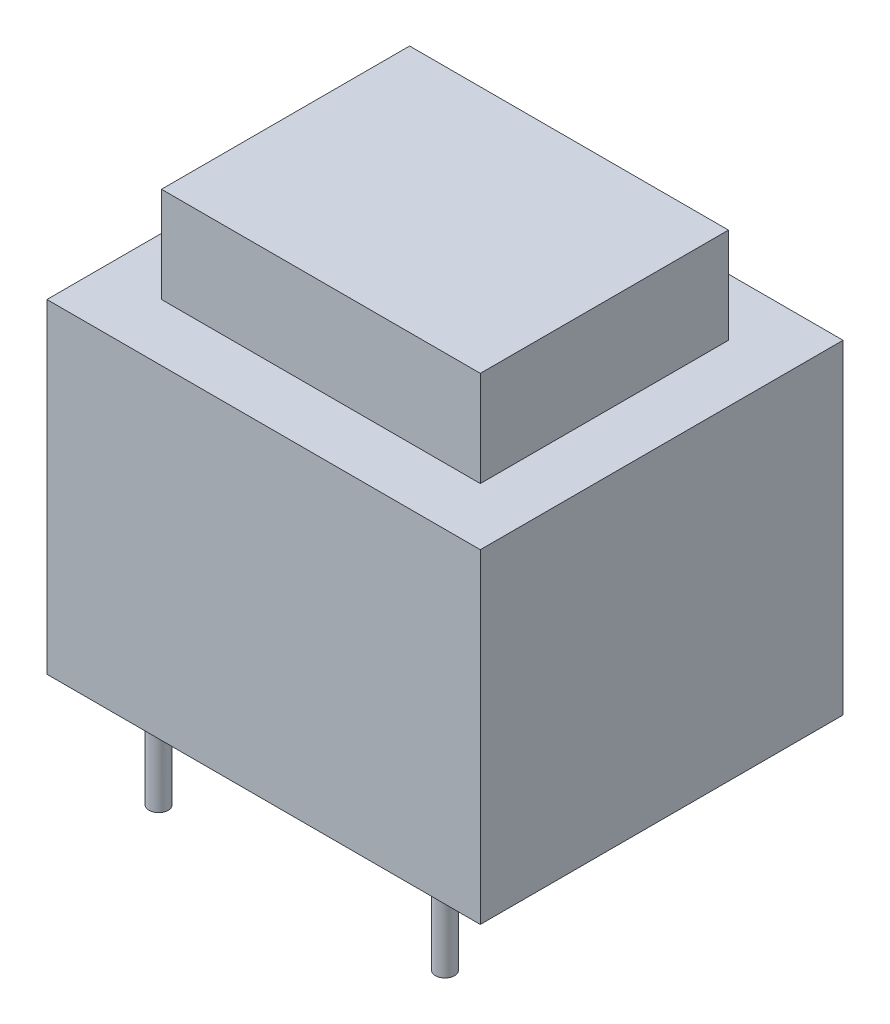
ISO-10303-21;
HEADER;
FILE_DESCRIPTION(('STEP AP214'),'2;1');
FILE_NAME('part.step','',(''),(''),'','','');
FILE_SCHEMA(('AUTOMOTIVE_DESIGN { 1 0 10303 214 1 1 1 1 }'));
ENDSEC;
DATA;
#1=APPLICATION_CONTEXT('core data for automotive mechanical design processes');
#2=APPLICATION_PROTOCOL_DEFINITION('international standard','automotive_design',2000,#1);
#3=PRODUCT_CONTEXT('',#1,'mechanical');
#4=PRODUCT('Part','Part','',(#3));
#5=PRODUCT_RELATED_PRODUCT_CATEGORY('part','',(#4));
#6=PRODUCT_DEFINITION_FORMATION('','',#4);
#7=PRODUCT_DEFINITION_CONTEXT('part definition',#1,'design');
#8=PRODUCT_DEFINITION('design','',#6,#7);
#9=PRODUCT_DEFINITION_SHAPE('','',#8);
#10=(LENGTH_UNIT() NAMED_UNIT(*) SI_UNIT(.MILLI.,.METRE.));
#11=(NAMED_UNIT(*) PLANE_ANGLE_UNIT() SI_UNIT($,.RADIAN.));
#12=(NAMED_UNIT(*) SI_UNIT($,.STERADIAN.) SOLID_ANGLE_UNIT());
#13=UNCERTAINTY_MEASURE_WITH_UNIT(LENGTH_MEASURE(1.E-05),#10,'distance_accuracy_value','');
#14=(GEOMETRIC_REPRESENTATION_CONTEXT(3) GLOBAL_UNCERTAINTY_ASSIGNED_CONTEXT((#13)) GLOBAL_UNIT_ASSIGNED_CONTEXT((#10,
#11,#12)) REPRESENTATION_CONTEXT('',''));
#15=CARTESIAN_POINT('',(0.,0.,0.));
#16=DIRECTION('',(0.,0.,1.));
#17=DIRECTION('',(1.,0.,0.));
#18=AXIS2_PLACEMENT_3D('',#15,#16,#17);
#19=CARTESIAN_POINT('',(0.,0.,19.));
#20=DIRECTION('',(1.,0.,0.));
#21=DIRECTION('',(0.,1.,0.));
#22=AXIS2_PLACEMENT_3D('',#19,#20,#21);
#23=PLANE('',#22);
#24=DIRECTION('',(0.,0.,1.));
#25=VECTOR('',#24,1.);
#26=CARTESIAN_POINT('',(0.,-5.,0.));
#27=LINE('',#26,#25);
#28=CARTESIAN_POINT('',(0.,-5.,0.));
#29=VERTEX_POINT('',#28);
#30=CARTESIAN_POINT('',(0.,-5.,19.));
#31=VERTEX_POINT('',#30);
#32=EDGE_CURVE('E136',#29,#31,#27,.T.);
#33=ORIENTED_EDGE('',*,*,#32,.F.);
#34=DIRECTION('',(0.,-1.,0.));
#35=VECTOR('',#34,1.);
#36=CARTESIAN_POINT('',(0.,0.,0.));
#37=LINE('',#36,#35);
#38=CARTESIAN_POINT('',(0.,-22.,0.));
#39=VERTEX_POINT('',#38);
#40=EDGE_CURVE('E158',#29,#39,#37,.T.);
#41=ORIENTED_EDGE('',*,*,#40,.T.);
#42=DIRECTION('',(0.,0.,-1.));
#43=VECTOR('',#42,1.);
#44=CARTESIAN_POINT('',(0.,-22.,19.));
#45=LINE('',#44,#43);
#46=CARTESIAN_POINT('',(0.,-22.,19.));
#47=VERTEX_POINT('',#46);
#48=EDGE_CURVE('E175',#47,#39,#45,.T.);
#49=ORIENTED_EDGE('',*,*,#48,.F.);
#50=DIRECTION('',(0.,-1.,0.));
#51=VECTOR('',#50,1.);
#52=CARTESIAN_POINT('',(0.,0.,19.));
#53=LINE('',#52,#51);
#54=EDGE_CURVE('E159',#31,#47,#53,.T.);
#55=ORIENTED_EDGE('',*,*,#54,.F.);
#56=EDGE_LOOP('',(#33,#41,#49,#55));
#57=FACE_BOUND('',#56,.T.);
#58=ADVANCED_FACE('F35',(#57),#23,.F.);
#59=CARTESIAN_POINT('',(22.7,0.,19.));
#60=DIRECTION('',(-1.,0.,0.));
#61=DIRECTION('',(0.,-1.,0.));
#62=AXIS2_PLACEMENT_3D('',#59,#60,#61);
#63=PLANE('',#62);
#64=DIRECTION('',(0.,0.,-1.));
#65=VECTOR('',#64,1.);
#66=CARTESIAN_POINT('',(22.7,-5.,0.));
#67=LINE('',#66,#65);
#68=CARTESIAN_POINT('',(22.7,-5.,19.));
#69=VERTEX_POINT('',#68);
#70=CARTESIAN_POINT('',(22.7,-5.,0.));
#71=VERTEX_POINT('',#70);
#72=EDGE_CURVE('E57',#69,#71,#67,.T.);
#73=ORIENTED_EDGE('',*,*,#72,.F.);
#74=DIRECTION('',(0.,1.,0.));
#75=VECTOR('',#74,1.);
#76=CARTESIAN_POINT('',(22.7,0.,19.));
#77=LINE('',#76,#75);
#78=CARTESIAN_POINT('',(22.7,-22.,19.));
#79=VERTEX_POINT('',#78);
#80=EDGE_CURVE('E164',#79,#69,#77,.T.);
#81=ORIENTED_EDGE('',*,*,#80,.F.);
#82=DIRECTION('',(0.,0.,-1.));
#83=VECTOR('',#82,1.);
#84=CARTESIAN_POINT('',(22.7,-22.,19.));
#85=LINE('',#84,#83);
#86=CARTESIAN_POINT('',(22.7,-22.,0.));
#87=VERTEX_POINT('',#86);
#88=EDGE_CURVE('E167',#79,#87,#85,.T.);
#89=ORIENTED_EDGE('',*,*,#88,.T.);
#90=DIRECTION('',(0.,1.,0.));
#91=VECTOR('',#90,1.);
#92=CARTESIAN_POINT('',(22.7,0.,0.));
#93=LINE('',#92,#91);
#94=EDGE_CURVE('E162',#87,#71,#93,.T.);
#95=ORIENTED_EDGE('',*,*,#94,.T.);
#96=EDGE_LOOP('',(#73,#81,#89,#95));
#97=FACE_BOUND('',#96,.T.);
#98=ADVANCED_FACE('F207',(#97),#63,.F.);
#99=CARTESIAN_POINT('',(0.,0.,19.));
#100=DIRECTION('',(0.,0.,1.));
#101=DIRECTION('',(1.,0.,0.));
#102=AXIS2_PLACEMENT_3D('',#99,#100,#101);
#103=PLANE('',#102);
#104=ORIENTED_EDGE('',*,*,#80,.T.);
#105=DIRECTION('',(1.,0.,0.));
#106=VECTOR('',#105,1.);
#107=CARTESIAN_POINT('',(0.,-5.,19.));
#108=LINE('',#107,#106);
#109=EDGE_CURVE('E141',#31,#69,#108,.T.);
#110=ORIENTED_EDGE('',*,*,#109,.F.);
#111=ORIENTED_EDGE('',*,*,#54,.T.);
#112=DIRECTION('',(1.,0.,0.));
#113=VECTOR('',#112,1.);
#114=CARTESIAN_POINT('',(0.,-22.,19.));
#115=LINE('',#114,#113);
#116=EDGE_CURVE('E161',#47,#79,#115,.T.);
#117=ORIENTED_EDGE('',*,*,#116,.T.);
#118=EDGE_LOOP('',(#104,#110,#111,#117));
#119=FACE_BOUND('',#118,.T.);
#120=ADVANCED_FACE('F213',(#119),#103,.T.);
#121=CARTESIAN_POINT('',(0.,0.,0.));
#122=DIRECTION('',(0.,0.,1.));
#123=DIRECTION('',(1.,0.,0.));
#124=AXIS2_PLACEMENT_3D('',#121,#122,#123);
#125=PLANE('',#124);
#126=DIRECTION('',(-1.,0.,0.));
#127=VECTOR('',#126,1.);
#128=CARTESIAN_POINT('',(0.,-5.,0.));
#129=LINE('',#128,#127);
#130=EDGE_CURVE('E144',#71,#29,#129,.T.);
#131=ORIENTED_EDGE('',*,*,#130,.F.);
#132=ORIENTED_EDGE('',*,*,#94,.F.);
#133=DIRECTION('',(1.,0.,0.));
#134=VECTOR('',#133,1.);
#135=CARTESIAN_POINT('',(0.,-22.,0.));
#136=LINE('',#135,#134);
#137=EDGE_CURVE('E169',#39,#87,#136,.T.);
#138=ORIENTED_EDGE('',*,*,#137,.F.);
#139=ORIENTED_EDGE('',*,*,#40,.F.);
#140=EDGE_LOOP('',(#131,#132,#138,#139));
#141=FACE_BOUND('',#140,.T.);
#142=ADVANCED_FACE('F192',(#141),#125,.F.);
#143=CARTESIAN_POINT('',(0.,-22.,19.));
#144=DIRECTION('',(0.,1.,0.));
#145=DIRECTION('',(0.,0.,1.));
#146=AXIS2_PLACEMENT_3D('',#143,#144,#145);
#147=PLANE('',#146);
#148=CARTESIAN_POINT('',(13.85,-22.,2.));
#149=DIRECTION('',(0.,1.,0.));
#150=DIRECTION('',(0.,0.,1.));
#151=AXIS2_PLACEMENT_3D('',#148,#149,#150);
#152=CIRCLE('',#151,0.500000000000001);
#153=CARTESIAN_POINT('',(13.85,-22.,2.5));
#154=VERTEX_POINT('',#153);
#155=EDGE_CURVE('E11',#154,#154,#152,.F.);
#156=ORIENTED_EDGE('',*,*,#155,.F.);
#157=EDGE_LOOP('',(#156));
#158=FACE_BOUND('',#157,.T.);
#159=CARTESIAN_POINT('',(8.85,-22.,2.));
#160=DIRECTION('',(0.,1.,0.));
#161=DIRECTION('',(0.,0.,1.));
#162=AXIS2_PLACEMENT_3D('',#159,#160,#161);
#163=CIRCLE('',#162,0.500000000000001);
#164=CARTESIAN_POINT('',(8.85,-22.,2.5));
#165=VERTEX_POINT('',#164);
#166=EDGE_CURVE('E42',#165,#165,#163,.F.);
#167=ORIENTED_EDGE('',*,*,#166,.F.);
#168=EDGE_LOOP('',(#167));
#169=FACE_BOUND('',#168,.T.);
#170=CARTESIAN_POINT('',(3.85,-22.,17.));
#171=DIRECTION('',(0.,1.,0.));
#172=DIRECTION('',(0.,0.,1.));
#173=AXIS2_PLACEMENT_3D('',#170,#171,#172);
#174=CIRCLE('',#173,0.500000000000001);
#175=CARTESIAN_POINT('',(3.85,-22.,17.5));
#176=VERTEX_POINT('',#175);
#177=EDGE_CURVE('E181',#176,#176,#174,.F.);
#178=ORIENTED_EDGE('',*,*,#177,.F.);
#179=EDGE_LOOP('',(#178));
#180=FACE_BOUND('',#179,.T.);
#181=CARTESIAN_POINT('',(18.85,-22.,17.));
#182=DIRECTION('',(0.,1.,0.));
#183=DIRECTION('',(0.,0.,1.));
#184=AXIS2_PLACEMENT_3D('',#181,#182,#183);
#185=CIRCLE('',#184,0.499999999999999);
#186=CARTESIAN_POINT('',(18.85,-22.,17.5));
#187=VERTEX_POINT('',#186);
#188=EDGE_CURVE('E178',#187,#187,#185,.F.);
#189=ORIENTED_EDGE('',*,*,#188,.F.);
#190=EDGE_LOOP('',(#189));
#191=FACE_BOUND('',#190,.T.);
#192=ORIENTED_EDGE('',*,*,#137,.T.);
#193=ORIENTED_EDGE('',*,*,#88,.F.);
#194=ORIENTED_EDGE('',*,*,#116,.F.);
#195=ORIENTED_EDGE('',*,*,#48,.T.);
#196=EDGE_LOOP('',(#192,#193,#194,#195));
#197=FACE_BOUND('',#196,.T.);
#198=ADVANCED_FACE('F188',(#158,#169,#180,#191,#197),#147,.F.);
#199=CARTESIAN_POINT('',(18.85,-27.,17.));
#200=DIRECTION('',(0.,1.,0.));
#201=DIRECTION('',(0.,0.,1.));
#202=AXIS2_PLACEMENT_3D('',#199,#200,#201);
#203=CYLINDRICAL_SURFACE('',#202,0.499999999999999);
#204=CARTESIAN_POINT('',(18.85,-27.,17.));
#205=DIRECTION('',(0.,-1.,0.));
#206=DIRECTION('',(0.,0.,-1.));
#207=AXIS2_PLACEMENT_3D('',#204,#205,#206);
#208=CIRCLE('',#207,0.499999999999999);
#209=CARTESIAN_POINT('',(18.85,-27.,16.5));
#210=VERTEX_POINT('',#209);
#211=EDGE_CURVE('E155',#210,#210,#208,.T.);
#212=ORIENTED_EDGE('',*,*,#211,.F.);
#213=EDGE_LOOP('',(#212));
#214=FACE_BOUND('',#213,.T.);
#215=ORIENTED_EDGE('',*,*,#188,.T.);
#216=EDGE_LOOP('',(#215));
#217=FACE_BOUND('',#216,.T.);
#218=ADVANCED_FACE('F191',(#214,#217),#203,.T.);
#219=CARTESIAN_POINT('',(18.85,-27.,17.));
#220=DIRECTION('',(0.,-1.,0.));
#221=DIRECTION('',(0.,0.,-1.));
#222=AXIS2_PLACEMENT_3D('',#219,#220,#221);
#223=PLANE('',#222);
#224=ORIENTED_EDGE('',*,*,#211,.T.);
#225=EDGE_LOOP('',(#224));
#226=FACE_BOUND('',#225,.T.);
#227=ADVANCED_FACE('F323',(#226),#223,.T.);
#228=CARTESIAN_POINT('',(3.85,-27.,17.));
#229=DIRECTION('',(0.,1.,0.));
#230=DIRECTION('',(0.,0.,1.));
#231=AXIS2_PLACEMENT_3D('',#228,#229,#230);
#232=CYLINDRICAL_SURFACE('',#231,0.500000000000001);
#233=CARTESIAN_POINT('',(3.85,-27.,17.));
#234=DIRECTION('',(0.,-1.,0.));
#235=DIRECTION('',(0.,0.,-1.));
#236=AXIS2_PLACEMENT_3D('',#233,#234,#235);
#237=CIRCLE('',#236,0.500000000000001);
#238=CARTESIAN_POINT('',(3.85,-27.,16.5));
#239=VERTEX_POINT('',#238);
#240=EDGE_CURVE('E152',#239,#239,#237,.T.);
#241=ORIENTED_EDGE('',*,*,#240,.F.);
#242=EDGE_LOOP('',(#241));
#243=FACE_BOUND('',#242,.T.);
#244=ORIENTED_EDGE('',*,*,#177,.T.);
#245=EDGE_LOOP('',(#244));
#246=FACE_BOUND('',#245,.T.);
#247=ADVANCED_FACE('F319',(#243,#246),#232,.T.);
#248=CARTESIAN_POINT('',(3.85,-27.,17.));
#249=DIRECTION('',(0.,-1.,0.));
#250=DIRECTION('',(0.,0.,-1.));
#251=AXIS2_PLACEMENT_3D('',#248,#249,#250);
#252=PLANE('',#251);
#253=ORIENTED_EDGE('',*,*,#240,.T.);
#254=EDGE_LOOP('',(#253));
#255=FACE_BOUND('',#254,.T.);
#256=ADVANCED_FACE('F315',(#255),#252,.T.);
#257=CARTESIAN_POINT('',(8.85,-27.,2.));
#258=DIRECTION('',(0.,1.,0.));
#259=DIRECTION('',(0.,0.,1.));
#260=AXIS2_PLACEMENT_3D('',#257,#258,#259);
#261=CYLINDRICAL_SURFACE('',#260,0.500000000000001);
#262=CARTESIAN_POINT('',(8.85,-27.,2.));
#263=DIRECTION('',(0.,-1.,0.));
#264=DIRECTION('',(0.,0.,-1.));
#265=AXIS2_PLACEMENT_3D('',#262,#263,#264);
#266=CIRCLE('',#265,0.500000000000001);
#267=CARTESIAN_POINT('',(8.85,-27.,1.5));
#268=VERTEX_POINT('',#267);
#269=EDGE_CURVE('E149',#268,#268,#266,.T.);
#270=ORIENTED_EDGE('',*,*,#269,.F.);
#271=EDGE_LOOP('',(#270));
#272=FACE_BOUND('',#271,.T.);
#273=ORIENTED_EDGE('',*,*,#166,.T.);
#274=EDGE_LOOP('',(#273));
#275=FACE_BOUND('',#274,.T.);
#276=ADVANCED_FACE('F186',(#272,#275),#261,.T.);
#277=CARTESIAN_POINT('',(8.85,-27.,2.));
#278=DIRECTION('',(0.,-1.,0.));
#279=DIRECTION('',(0.,0.,-1.));
#280=AXIS2_PLACEMENT_3D('',#277,#278,#279);
#281=PLANE('',#280);
#282=ORIENTED_EDGE('',*,*,#269,.T.);
#283=EDGE_LOOP('',(#282));
#284=FACE_BOUND('',#283,.T.);
#285=ADVANCED_FACE('F308',(#284),#281,.T.);
#286=CARTESIAN_POINT('',(13.85,-27.,2.));
#287=DIRECTION('',(0.,1.,0.));
#288=DIRECTION('',(0.,0.,1.));
#289=AXIS2_PLACEMENT_3D('',#286,#287,#288);
#290=CYLINDRICAL_SURFACE('',#289,0.500000000000001);
#291=CARTESIAN_POINT('',(13.85,-27.,2.));
#292=DIRECTION('',(0.,-1.,0.));
#293=DIRECTION('',(0.,0.,-1.));
#294=AXIS2_PLACEMENT_3D('',#291,#292,#293);
#295=CIRCLE('',#294,0.500000000000001);
#296=CARTESIAN_POINT('',(13.85,-27.,1.5));
#297=VERTEX_POINT('',#296);
#298=EDGE_CURVE('E146',#297,#297,#295,.T.);
#299=ORIENTED_EDGE('',*,*,#298,.F.);
#300=EDGE_LOOP('',(#299));
#301=FACE_BOUND('',#300,.T.);
#302=ORIENTED_EDGE('',*,*,#155,.T.);
#303=EDGE_LOOP('',(#302));
#304=FACE_BOUND('',#303,.T.);
#305=ADVANCED_FACE('F304',(#301,#304),#290,.T.);
#306=CARTESIAN_POINT('',(13.85,-27.,2.));
#307=DIRECTION('',(0.,-1.,0.));
#308=DIRECTION('',(0.,0.,-1.));
#309=AXIS2_PLACEMENT_3D('',#306,#307,#308);
#310=PLANE('',#309);
#311=ORIENTED_EDGE('',*,*,#298,.T.);
#312=EDGE_LOOP('',(#311));
#313=FACE_BOUND('',#312,.T.);
#314=ADVANCED_FACE('F252',(#313),#310,.T.);
#315=CARTESIAN_POINT('',(0.,-5.,0.));
#316=DIRECTION('',(0.,1.,0.));
#317=DIRECTION('',(0.,0.,1.));
#318=AXIS2_PLACEMENT_3D('',#315,#316,#317);
#319=PLANE('',#318);
#320=DIRECTION('',(-1.,0.,0.));
#321=VECTOR('',#320,1.);
#322=CARTESIAN_POINT('',(3.,-5.,3.00359604437299));
#323=LINE('',#322,#321);
#324=CARTESIAN_POINT('',(19.7,-5.,3.00359604437299));
#325=VERTEX_POINT('',#324);
#326=CARTESIAN_POINT('',(3.,-5.,3.00359604437299));
#327=VERTEX_POINT('',#326);
#328=EDGE_CURVE('E111',#325,#327,#323,.T.);
#329=ORIENTED_EDGE('',*,*,#328,.F.);
#330=DIRECTION('',(0.,0.,-1.));
#331=VECTOR('',#330,1.);
#332=CARTESIAN_POINT('',(19.7,-5.,3.00359604437299));
#333=LINE('',#332,#331);
#334=CARTESIAN_POINT('',(19.7,-5.,16.));
#335=VERTEX_POINT('',#334);
#336=EDGE_CURVE('E120',#335,#325,#333,.T.);
#337=ORIENTED_EDGE('',*,*,#336,.F.);
#338=DIRECTION('',(1.,0.,0.));
#339=VECTOR('',#338,1.);
#340=CARTESIAN_POINT('',(3.,-5.,16.));
#341=LINE('',#340,#339);
#342=CARTESIAN_POINT('',(3.,-5.,16.));
#343=VERTEX_POINT('',#342);
#344=EDGE_CURVE('E103',#343,#335,#341,.T.);
#345=ORIENTED_EDGE('',*,*,#344,.F.);
#346=DIRECTION('',(0.,0.,1.));
#347=VECTOR('',#346,1.);
#348=CARTESIAN_POINT('',(3.,-5.,3.00359604437299));
#349=LINE('',#348,#347);
#350=EDGE_CURVE('E117',#327,#343,#349,.T.);
#351=ORIENTED_EDGE('',*,*,#350,.F.);
#352=EDGE_LOOP('',(#329,#337,#345,#351));
#353=FACE_BOUND('',#352,.T.);
#354=ORIENTED_EDGE('',*,*,#32,.T.);
#355=ORIENTED_EDGE('',*,*,#109,.T.);
#356=ORIENTED_EDGE('',*,*,#72,.T.);
#357=ORIENTED_EDGE('',*,*,#130,.T.);
#358=EDGE_LOOP('',(#354,#355,#356,#357));
#359=FACE_BOUND('',#358,.T.);
#360=ADVANCED_FACE('F116',(#353,#359),#319,.T.);
#361=CARTESIAN_POINT('',(3.,-5.,3.00359604437299));
#362=DIRECTION('',(-1.,0.,0.));
#363=DIRECTION('',(0.,0.,1.));
#364=AXIS2_PLACEMENT_3D('',#361,#362,#363);
#365=PLANE('',#364);
#366=DIRECTION('',(0.,0.,1.));
#367=VECTOR('',#366,1.);
#368=CARTESIAN_POINT('',(3.,0.,3.00359604437299));
#369=LINE('',#368,#367);
#370=CARTESIAN_POINT('',(3.,0.,3.00359604437299));
#371=VERTEX_POINT('',#370);
#372=CARTESIAN_POINT('',(3.,0.,16.));
#373=VERTEX_POINT('',#372);
#374=EDGE_CURVE('E131',#371,#373,#369,.T.);
#375=ORIENTED_EDGE('',*,*,#374,.F.);
#376=DIRECTION('',(0.,1.,0.));
#377=VECTOR('',#376,1.);
#378=CARTESIAN_POINT('',(3.,-5.,3.00359604437299));
#379=LINE('',#378,#377);
#380=EDGE_CURVE('E123',#327,#371,#379,.T.);
#381=ORIENTED_EDGE('',*,*,#380,.F.);
#382=ORIENTED_EDGE('',*,*,#350,.T.);
#383=DIRECTION('',(0.,1.,0.));
#384=VECTOR('',#383,1.);
#385=CARTESIAN_POINT('',(3.,-5.,16.));
#386=LINE('',#385,#384);
#387=EDGE_CURVE('E100',#343,#373,#386,.T.);
#388=ORIENTED_EDGE('',*,*,#387,.T.);
#389=EDGE_LOOP('',(#375,#381,#382,#388));
#390=FACE_BOUND('',#389,.T.);
#391=ADVANCED_FACE('F122',(#390),#365,.T.);
#392=CARTESIAN_POINT('',(3.,-5.,3.00359604437299));
#393=DIRECTION('',(0.,0.,-1.));
#394=DIRECTION('',(-1.,0.,0.));
#395=AXIS2_PLACEMENT_3D('',#392,#393,#394);
#396=PLANE('',#395);
#397=DIRECTION('',(-1.,0.,0.));
#398=VECTOR('',#397,1.);
#399=CARTESIAN_POINT('',(3.,0.,3.00359604437299));
#400=LINE('',#399,#398);
#401=CARTESIAN_POINT('',(19.7,0.,3.00359604437299));
#402=VERTEX_POINT('',#401);
#403=EDGE_CURVE('E124',#402,#371,#400,.T.);
#404=ORIENTED_EDGE('',*,*,#403,.F.);
#405=DIRECTION('',(0.,1.,0.));
#406=VECTOR('',#405,1.);
#407=CARTESIAN_POINT('',(19.7,-5.,3.00359604437299));
#408=LINE('',#407,#406);
#409=EDGE_CURVE('E137',#325,#402,#408,.T.);
#410=ORIENTED_EDGE('',*,*,#409,.F.);
#411=ORIENTED_EDGE('',*,*,#328,.T.);
#412=ORIENTED_EDGE('',*,*,#380,.T.);
#413=EDGE_LOOP('',(#404,#410,#411,#412));
#414=FACE_BOUND('',#413,.T.);
#415=ADVANCED_FACE('F262',(#414),#396,.T.);
#416=CARTESIAN_POINT('',(19.7,-5.,3.00359604437299));
#417=DIRECTION('',(1.,0.,0.));
#418=DIRECTION('',(0.,0.,-1.));
#419=AXIS2_PLACEMENT_3D('',#416,#417,#418);
#420=PLANE('',#419);
#421=DIRECTION('',(0.,0.,-1.));
#422=VECTOR('',#421,1.);
#423=CARTESIAN_POINT('',(19.7,0.,3.00359604437299));
#424=LINE('',#423,#422);
#425=CARTESIAN_POINT('',(19.7,0.,16.));
#426=VERTEX_POINT('',#425);
#427=EDGE_CURVE('E49',#426,#402,#424,.T.);
#428=ORIENTED_EDGE('',*,*,#427,.F.);
#429=DIRECTION('',(0.,1.,0.));
#430=VECTOR('',#429,1.);
#431=CARTESIAN_POINT('',(19.7,-5.,16.));
#432=LINE('',#431,#430);
#433=EDGE_CURVE('E110',#335,#426,#432,.T.);
#434=ORIENTED_EDGE('',*,*,#433,.F.);
#435=ORIENTED_EDGE('',*,*,#336,.T.);
#436=ORIENTED_EDGE('',*,*,#409,.T.);
#437=EDGE_LOOP('',(#428,#434,#435,#436));
#438=FACE_BOUND('',#437,.T.);
#439=ADVANCED_FACE('F271',(#438),#420,.T.);
#440=CARTESIAN_POINT('',(3.,-5.,16.));
#441=DIRECTION('',(0.,0.,1.));
#442=DIRECTION('',(1.,0.,0.));
#443=AXIS2_PLACEMENT_3D('',#440,#441,#442);
#444=PLANE('',#443);
#445=DIRECTION('',(1.,0.,0.));
#446=VECTOR('',#445,1.);
#447=CARTESIAN_POINT('',(3.,0.,16.));
#448=LINE('',#447,#446);
#449=EDGE_CURVE('E105',#373,#426,#448,.T.);
#450=ORIENTED_EDGE('',*,*,#449,.F.);
#451=ORIENTED_EDGE('',*,*,#387,.F.);
#452=ORIENTED_EDGE('',*,*,#344,.T.);
#453=ORIENTED_EDGE('',*,*,#433,.T.);
#454=EDGE_LOOP('',(#450,#451,#452,#453));
#455=FACE_BOUND('',#454,.T.);
#456=ADVANCED_FACE('F102',(#455),#444,.T.);
#457=CARTESIAN_POINT('',(0.,0.,19.));
#458=DIRECTION('',(0.,-1.,0.));
#459=DIRECTION('',(0.,0.,-1.));
#460=AXIS2_PLACEMENT_3D('',#457,#458,#459);
#461=PLANE('',#460);
#462=ORIENTED_EDGE('',*,*,#374,.T.);
#463=ORIENTED_EDGE('',*,*,#449,.T.);
#464=ORIENTED_EDGE('',*,*,#427,.T.);
#465=ORIENTED_EDGE('',*,*,#403,.T.);
#466=EDGE_LOOP('',(#462,#463,#464,#465));
#467=FACE_BOUND('',#466,.T.);
#468=ADVANCED_FACE('F289',(#467),#461,.F.);
#469=CLOSED_SHELL('',(#58,#98,#120,#142,#198,#218,#227,#247,#256,#276,#285,#305,#314,#360,#391,
#415,#439,#456,#468));
#470=MANIFOLD_SOLID_BREP('B2',#469);
#471=ADVANCED_BREP_SHAPE_REPRESENTATION('',(#18,#470),#14);
#472=SHAPE_DEFINITION_REPRESENTATION(#9,#471);
ENDSEC;
END-ISO-10303-21;
